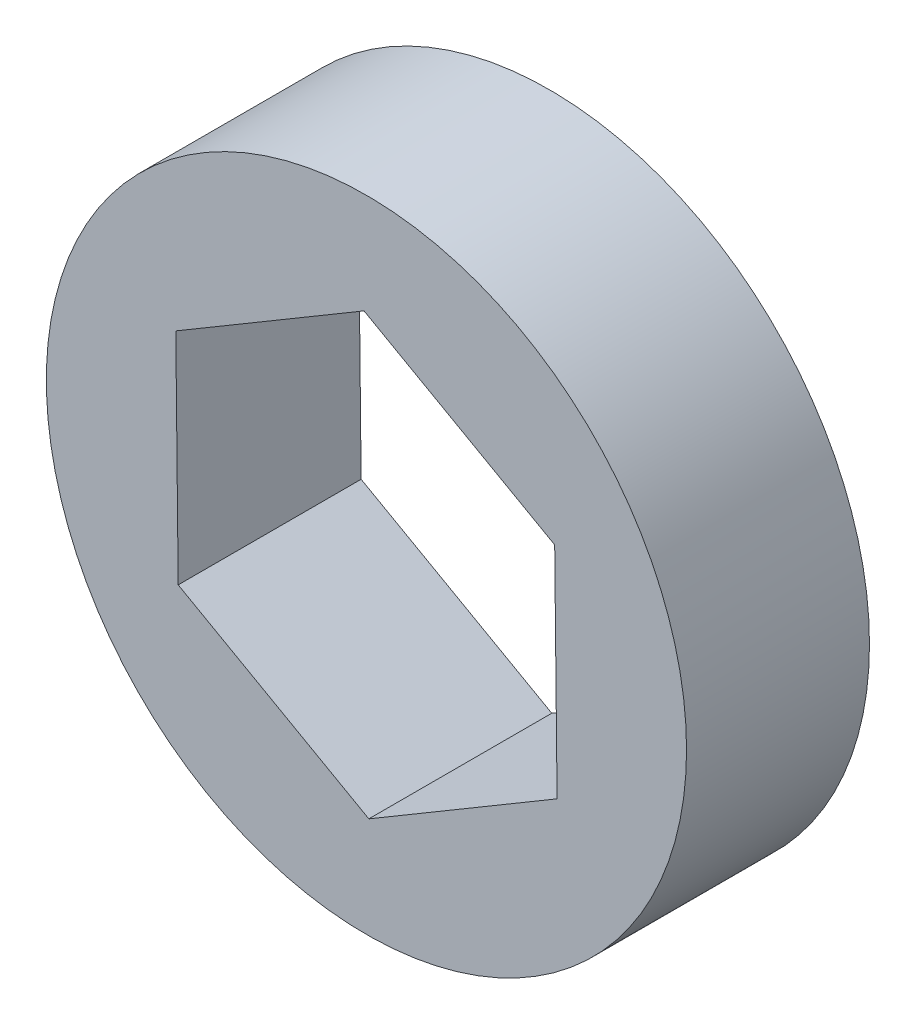
ISO-10303-21;
HEADER;
FILE_DESCRIPTION(('STEP AP214'),'2;1');
FILE_NAME('part.step','',(''),(''),'','','');
FILE_SCHEMA(('AUTOMOTIVE_DESIGN { 1 0 10303 214 1 1 1 1 }'));
ENDSEC;
DATA;
#1=APPLICATION_CONTEXT('core data for automotive mechanical design processes');
#2=APPLICATION_PROTOCOL_DEFINITION('international standard','automotive_design',2000,#1);
#3=PRODUCT_CONTEXT('',#1,'mechanical');
#4=PRODUCT('Part','Part','',(#3));
#5=PRODUCT_RELATED_PRODUCT_CATEGORY('part','',(#4));
#6=PRODUCT_DEFINITION_FORMATION('','',#4);
#7=PRODUCT_DEFINITION_CONTEXT('part definition',#1,'design');
#8=PRODUCT_DEFINITION('design','',#6,#7);
#9=PRODUCT_DEFINITION_SHAPE('','',#8);
#10=(LENGTH_UNIT() NAMED_UNIT(*) SI_UNIT(.MILLI.,.METRE.));
#11=(NAMED_UNIT(*) PLANE_ANGLE_UNIT() SI_UNIT($,.RADIAN.));
#12=(NAMED_UNIT(*) SI_UNIT($,.STERADIAN.) SOLID_ANGLE_UNIT());
#13=UNCERTAINTY_MEASURE_WITH_UNIT(LENGTH_MEASURE(1.E-05),#10,'distance_accuracy_value','');
#14=(GEOMETRIC_REPRESENTATION_CONTEXT(3) GLOBAL_UNCERTAINTY_ASSIGNED_CONTEXT((#13)) GLOBAL_UNIT_ASSIGNED_CONTEXT((#10,
#11,#12)) REPRESENTATION_CONTEXT('',''));
#15=CARTESIAN_POINT('',(0.,0.,0.));
#16=DIRECTION('',(0.,0.,1.));
#17=DIRECTION('',(1.,0.,0.));
#18=AXIS2_PLACEMENT_3D('',#15,#16,#17);
#19=CARTESIAN_POINT('',(0.,0.,7.));
#20=DIRECTION('',(0.,0.,1.));
#21=DIRECTION('',(1.,0.,0.));
#22=AXIS2_PLACEMENT_3D('',#19,#20,#21);
#23=PLANE('',#22);
#24=CARTESIAN_POINT('',(0.,0.,7.));
#25=DIRECTION('',(0.,0.,1.));
#26=DIRECTION('',(1.,0.,0.));
#27=AXIS2_PLACEMENT_3D('',#24,#25,#26);
#28=CIRCLE('',#27,12.25);
#29=CARTESIAN_POINT('',(12.25,0.,7.));
#30=VERTEX_POINT('',#29);
#31=EDGE_CURVE('E11',#30,#30,#28,.T.);
#32=ORIENTED_EDGE('',*,*,#31,.T.);
#33=EDGE_LOOP('',(#32));
#34=FACE_BOUND('',#33,.T.);
#35=DIRECTION('',(-0.0109535044534959,0.999940008570608,0.));
#36=VECTOR('',#35,1.);
#37=CARTESIAN_POINT('',(7.29541412553668,-4.1061254328446,7.));
#38=LINE('',#37,#36);
#39=CARTESIAN_POINT('',(7.29541412553668,-4.1061254328446,7.));
#40=VERTEX_POINT('',#39);
#41=CARTESIAN_POINT('',(7.20371599873714,4.26495124742029,7.));
#42=VERTEX_POINT('',#41);
#43=EDGE_CURVE('E96',#40,#42,#38,.T.);
#44=ORIENTED_EDGE('',*,*,#43,.F.);
#45=DIRECTION('',(0.860496697455828,0.509456017402497,0.));
#46=VECTOR('',#45,1.);
#47=CARTESIAN_POINT('',(0.091698126799533,-8.3710766802649,7.));
#48=LINE('',#47,#46);
#49=CARTESIAN_POINT('',(0.091698126799533,-8.3710766802649,7.));
#50=VERTEX_POINT('',#49);
#51=EDGE_CURVE('E88',#50,#40,#48,.T.);
#52=ORIENTED_EDGE('',*,*,#51,.F.);
#53=DIRECTION('',(0.871450201909323,-0.490483991168111,0.));
#54=VECTOR('',#53,1.);
#55=CARTESIAN_POINT('',(-7.20371599873714,-4.26495124742029,7.));
#56=LINE('',#55,#54);
#57=CARTESIAN_POINT('',(-7.20371599873714,-4.26495124742029,7.));
#58=VERTEX_POINT('',#57);
#59=EDGE_CURVE('E116',#58,#50,#56,.T.);
#60=ORIENTED_EDGE('',*,*,#59,.F.);
#61=DIRECTION('',(0.0109535044534956,-0.999940008570608,0.));
#62=VECTOR('',#61,1.);
#63=CARTESIAN_POINT('',(-7.29541412553667,4.1061254328446,7.));
#64=LINE('',#63,#62);
#65=CARTESIAN_POINT('',(-7.29541412553667,4.1061254328446,7.));
#66=VERTEX_POINT('',#65);
#67=EDGE_CURVE('E114',#66,#58,#64,.T.);
#68=ORIENTED_EDGE('',*,*,#67,.F.);
#69=DIRECTION('',(-0.860496697455828,-0.509456017402497,0.));
#70=VECTOR('',#69,1.);
#71=CARTESIAN_POINT('',(-0.091698126799533,8.3710766802649,7.));
#72=LINE('',#71,#70);
#73=CARTESIAN_POINT('',(-0.091698126799533,8.3710766802649,7.));
#74=VERTEX_POINT('',#73);
#75=EDGE_CURVE('E110',#74,#66,#72,.T.);
#76=ORIENTED_EDGE('',*,*,#75,.F.);
#77=DIRECTION('',(-0.871450201909324,0.490483991168111,0.));
#78=VECTOR('',#77,1.);
#79=CARTESIAN_POINT('',(7.20371599873714,4.26495124742029,7.));
#80=LINE('',#79,#78);
#81=EDGE_CURVE('E108',#42,#74,#80,.T.);
#82=ORIENTED_EDGE('',*,*,#81,.F.);
#83=EDGE_LOOP('',(#44,#52,#60,#68,#76,#82));
#84=FACE_BOUND('',#83,.T.);
#85=ADVANCED_FACE('F35',(#34,#84),#23,.T.);
#86=CARTESIAN_POINT('',(0.,0.,0.));
#87=DIRECTION('',(0.,0.,1.));
#88=DIRECTION('',(1.,0.,0.));
#89=AXIS2_PLACEMENT_3D('',#86,#87,#88);
#90=PLANE('',#89);
#91=CARTESIAN_POINT('',(0.,0.,0.));
#92=DIRECTION('',(0.,0.,1.));
#93=DIRECTION('',(1.,0.,0.));
#94=AXIS2_PLACEMENT_3D('',#91,#92,#93);
#95=CIRCLE('',#94,12.25);
#96=CARTESIAN_POINT('',(12.25,0.,0.));
#97=VERTEX_POINT('',#96);
#98=EDGE_CURVE('E39',#97,#97,#95,.T.);
#99=ORIENTED_EDGE('',*,*,#98,.F.);
#100=EDGE_LOOP('',(#99));
#101=FACE_BOUND('',#100,.T.);
#102=DIRECTION('',(0.860496697455828,0.509456017402497,0.));
#103=VECTOR('',#102,1.);
#104=CARTESIAN_POINT('',(0.091698126799533,-8.3710766802649,0.));
#105=LINE('',#104,#103);
#106=CARTESIAN_POINT('',(0.091698126799533,-8.3710766802649,0.));
#107=VERTEX_POINT('',#106);
#108=CARTESIAN_POINT('',(7.29541412553668,-4.1061254328446,0.));
#109=VERTEX_POINT('',#108);
#110=EDGE_CURVE('E58',#107,#109,#105,.T.);
#111=ORIENTED_EDGE('',*,*,#110,.T.);
#112=DIRECTION('',(-0.0109535044534959,0.999940008570608,0.));
#113=VECTOR('',#112,1.);
#114=CARTESIAN_POINT('',(7.29541412553668,-4.1061254328446,0.));
#115=LINE('',#114,#113);
#116=CARTESIAN_POINT('',(7.20371599873714,4.26495124742029,0.));
#117=VERTEX_POINT('',#116);
#118=EDGE_CURVE('E103',#109,#117,#115,.T.);
#119=ORIENTED_EDGE('',*,*,#118,.T.);
#120=DIRECTION('',(-0.871450201909324,0.490483991168111,0.));
#121=VECTOR('',#120,1.);
#122=CARTESIAN_POINT('',(7.20371599873714,4.26495124742029,0.));
#123=LINE('',#122,#121);
#124=CARTESIAN_POINT('',(-0.091698126799533,8.3710766802649,0.));
#125=VERTEX_POINT('',#124);
#126=EDGE_CURVE('E120',#117,#125,#123,.T.);
#127=ORIENTED_EDGE('',*,*,#126,.T.);
#128=DIRECTION('',(-0.860496697455828,-0.509456017402497,0.));
#129=VECTOR('',#128,1.);
#130=CARTESIAN_POINT('',(-0.091698126799533,8.3710766802649,0.));
#131=LINE('',#130,#129);
#132=CARTESIAN_POINT('',(-7.29541412553667,4.1061254328446,0.));
#133=VERTEX_POINT('',#132);
#134=EDGE_CURVE('E123',#125,#133,#131,.T.);
#135=ORIENTED_EDGE('',*,*,#134,.T.);
#136=DIRECTION('',(0.0109535044534956,-0.999940008570608,0.));
#137=VECTOR('',#136,1.);
#138=CARTESIAN_POINT('',(-7.29541412553667,4.1061254328446,0.));
#139=LINE('',#138,#137);
#140=CARTESIAN_POINT('',(-7.20371599873714,-4.26495124742029,0.));
#141=VERTEX_POINT('',#140);
#142=EDGE_CURVE('E126',#133,#141,#139,.T.);
#143=ORIENTED_EDGE('',*,*,#142,.T.);
#144=DIRECTION('',(0.871450201909323,-0.490483991168111,0.));
#145=VECTOR('',#144,1.);
#146=CARTESIAN_POINT('',(-7.20371599873714,-4.26495124742029,0.));
#147=LINE('',#146,#145);
#148=EDGE_CURVE('E97',#141,#107,#147,.T.);
#149=ORIENTED_EDGE('',*,*,#148,.T.);
#150=EDGE_LOOP('',(#111,#119,#127,#135,#143,#149));
#151=FACE_BOUND('',#150,.T.);
#152=ADVANCED_FACE('F143',(#101,#151),#90,.F.);
#153=CARTESIAN_POINT('',(0.,0.,7.));
#154=DIRECTION('',(0.,0.,-1.));
#155=DIRECTION('',(-1.,0.,0.));
#156=AXIS2_PLACEMENT_3D('',#153,#154,#155);
#157=CYLINDRICAL_SURFACE('',#156,12.25);
#158=ORIENTED_EDGE('',*,*,#31,.F.);
#159=EDGE_LOOP('',(#158));
#160=FACE_BOUND('',#159,.T.);
#161=ORIENTED_EDGE('',*,*,#98,.T.);
#162=EDGE_LOOP('',(#161));
#163=FACE_BOUND('',#162,.T.);
#164=ADVANCED_FACE('F37',(#160,#163),#157,.T.);
#165=CARTESIAN_POINT('',(0.091698126799533,-8.3710766802649,7.));
#166=DIRECTION('',(-0.509456017402497,0.860496697455828,0.));
#167=DIRECTION('',(-0.860496697455828,-0.509456017402497,0.));
#168=AXIS2_PLACEMENT_3D('',#165,#166,#167);
#169=PLANE('',#168);
#170=ORIENTED_EDGE('',*,*,#110,.F.);
#171=DIRECTION('',(0.,0.,-1.));
#172=VECTOR('',#171,1.);
#173=CARTESIAN_POINT('',(0.091698126799533,-8.3710766802649,7.));
#174=LINE('',#173,#172);
#175=EDGE_CURVE('E92',#50,#107,#174,.T.);
#176=ORIENTED_EDGE('',*,*,#175,.F.);
#177=ORIENTED_EDGE('',*,*,#51,.T.);
#178=DIRECTION('',(0.,0.,-1.));
#179=VECTOR('',#178,1.);
#180=CARTESIAN_POINT('',(7.29541412553668,-4.1061254328446,7.));
#181=LINE('',#180,#179);
#182=EDGE_CURVE('E91',#40,#109,#181,.T.);
#183=ORIENTED_EDGE('',*,*,#182,.T.);
#184=EDGE_LOOP('',(#170,#176,#177,#183));
#185=FACE_BOUND('',#184,.T.);
#186=ADVANCED_FACE('F90',(#185),#169,.T.);
#187=CARTESIAN_POINT('',(7.29541412553668,-4.1061254328446,7.));
#188=DIRECTION('',(-0.999940008570608,-0.0109535044534959,0.));
#189=DIRECTION('',(0.0109535044534959,-0.999940008570608,0.));
#190=AXIS2_PLACEMENT_3D('',#187,#188,#189);
#191=PLANE('',#190);
#192=ORIENTED_EDGE('',*,*,#118,.F.);
#193=ORIENTED_EDGE('',*,*,#182,.F.);
#194=ORIENTED_EDGE('',*,*,#43,.T.);
#195=DIRECTION('',(0.,0.,-1.));
#196=VECTOR('',#195,1.);
#197=CARTESIAN_POINT('',(7.20371599873714,4.26495124742029,7.));
#198=LINE('',#197,#196);
#199=EDGE_CURVE('E104',#42,#117,#198,.T.);
#200=ORIENTED_EDGE('',*,*,#199,.T.);
#201=EDGE_LOOP('',(#192,#193,#194,#200));
#202=FACE_BOUND('',#201,.T.);
#203=ADVANCED_FACE('F100',(#202),#191,.T.);
#204=CARTESIAN_POINT('',(7.20371599873714,4.26495124742029,7.));
#205=DIRECTION('',(-0.490483991168111,-0.871450201909324,0.));
#206=DIRECTION('',(0.871450201909324,-0.490483991168111,0.));
#207=AXIS2_PLACEMENT_3D('',#204,#205,#206);
#208=PLANE('',#207);
#209=ORIENTED_EDGE('',*,*,#126,.F.);
#210=ORIENTED_EDGE('',*,*,#199,.F.);
#211=ORIENTED_EDGE('',*,*,#81,.T.);
#212=DIRECTION('',(0.,0.,-1.));
#213=VECTOR('',#212,1.);
#214=CARTESIAN_POINT('',(-0.091698126799533,8.3710766802649,7.));
#215=LINE('',#214,#213);
#216=EDGE_CURVE('E135',#74,#125,#215,.T.);
#217=ORIENTED_EDGE('',*,*,#216,.T.);
#218=EDGE_LOOP('',(#209,#210,#211,#217));
#219=FACE_BOUND('',#218,.T.);
#220=ADVANCED_FACE('F139',(#219),#208,.T.);
#221=CARTESIAN_POINT('',(-0.091698126799533,8.3710766802649,7.));
#222=DIRECTION('',(0.509456017402497,-0.860496697455828,0.));
#223=DIRECTION('',(0.860496697455828,0.509456017402497,0.));
#224=AXIS2_PLACEMENT_3D('',#221,#222,#223);
#225=PLANE('',#224);
#226=ORIENTED_EDGE('',*,*,#134,.F.);
#227=ORIENTED_EDGE('',*,*,#216,.F.);
#228=ORIENTED_EDGE('',*,*,#75,.T.);
#229=DIRECTION('',(0.,0.,-1.));
#230=VECTOR('',#229,1.);
#231=CARTESIAN_POINT('',(-7.29541412553667,4.1061254328446,7.));
#232=LINE('',#231,#230);
#233=EDGE_CURVE('E133',#66,#133,#232,.T.);
#234=ORIENTED_EDGE('',*,*,#233,.T.);
#235=EDGE_LOOP('',(#226,#227,#228,#234));
#236=FACE_BOUND('',#235,.T.);
#237=ADVANCED_FACE('F151',(#236),#225,.T.);
#238=CARTESIAN_POINT('',(-7.29541412553667,4.1061254328446,7.));
#239=DIRECTION('',(0.999940008570608,0.0109535044534956,0.));
#240=DIRECTION('',(-0.0109535044534956,0.999940008570608,0.));
#241=AXIS2_PLACEMENT_3D('',#238,#239,#240);
#242=PLANE('',#241);
#243=ORIENTED_EDGE('',*,*,#142,.F.);
#244=ORIENTED_EDGE('',*,*,#233,.F.);
#245=ORIENTED_EDGE('',*,*,#67,.T.);
#246=DIRECTION('',(0.,0.,-1.));
#247=VECTOR('',#246,1.);
#248=CARTESIAN_POINT('',(-7.20371599873714,-4.26495124742029,7.));
#249=LINE('',#248,#247);
#250=EDGE_CURVE('E50',#58,#141,#249,.T.);
#251=ORIENTED_EDGE('',*,*,#250,.T.);
#252=EDGE_LOOP('',(#243,#244,#245,#251));
#253=FACE_BOUND('',#252,.T.);
#254=ADVANCED_FACE('F149',(#253),#242,.T.);
#255=CARTESIAN_POINT('',(-7.20371599873714,-4.26495124742029,7.));
#256=DIRECTION('',(0.490483991168111,0.871450201909323,0.));
#257=DIRECTION('',(-0.871450201909323,0.490483991168111,0.));
#258=AXIS2_PLACEMENT_3D('',#255,#256,#257);
#259=PLANE('',#258);
#260=ORIENTED_EDGE('',*,*,#148,.F.);
#261=ORIENTED_EDGE('',*,*,#250,.F.);
#262=ORIENTED_EDGE('',*,*,#59,.T.);
#263=ORIENTED_EDGE('',*,*,#175,.T.);
#264=EDGE_LOOP('',(#260,#261,#262,#263));
#265=FACE_BOUND('',#264,.T.);
#266=ADVANCED_FACE('F145',(#265),#259,.T.);
#267=CLOSED_SHELL('',(#85,#152,#164,#186,#203,#220,#237,#254,#266));
#268=MANIFOLD_SOLID_BREP('B2',#267);
#269=ADVANCED_BREP_SHAPE_REPRESENTATION('',(#18,#268),#14);
#270=SHAPE_DEFINITION_REPRESENTATION(#9,#269);
ENDSEC;
END-ISO-10303-21;
